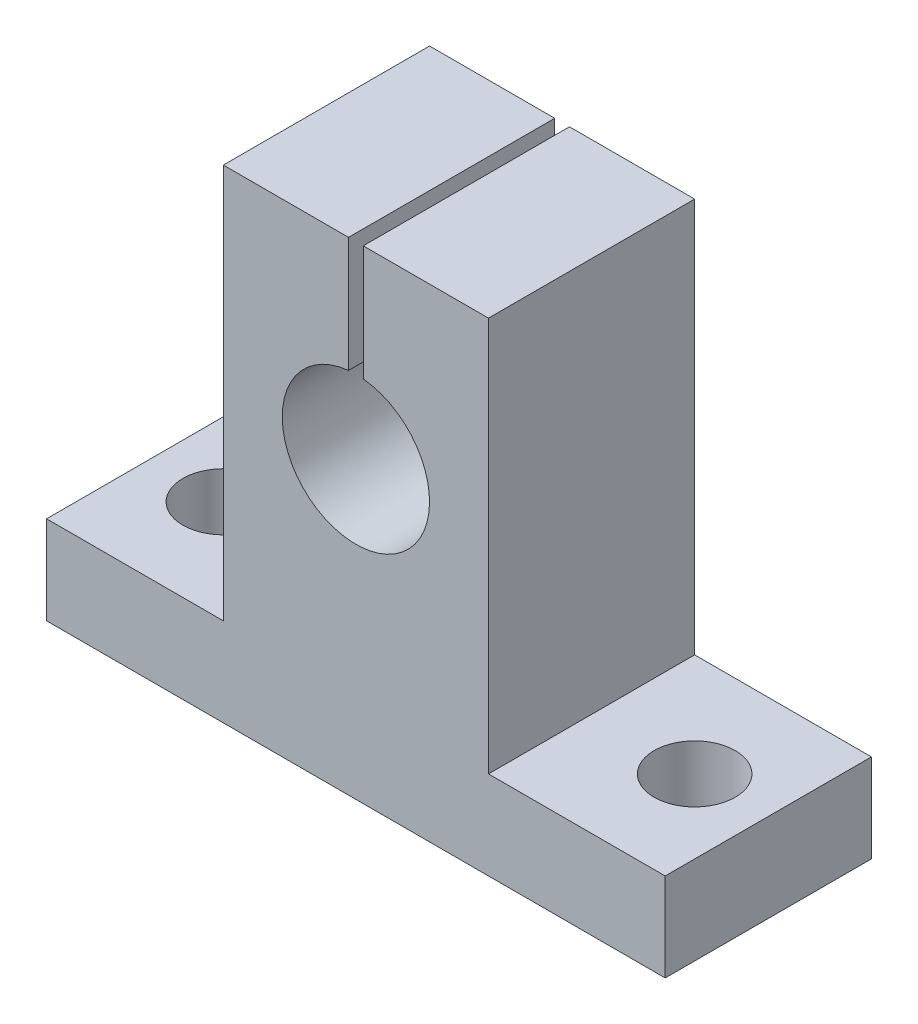
ISO-10303-21;
HEADER;
FILE_DESCRIPTION(('STEP AP214'),'2;1');
FILE_NAME('part.step','',(''),(''),'','','');
FILE_SCHEMA(('AUTOMOTIVE_DESIGN { 1 0 10303 214 1 1 1 1 }'));
ENDSEC;
DATA;
#1=APPLICATION_CONTEXT('core data for automotive mechanical design processes');
#2=APPLICATION_PROTOCOL_DEFINITION('international standard','automotive_design',2000,#1);
#3=PRODUCT_CONTEXT('',#1,'mechanical');
#4=PRODUCT('Part','Part','',(#3));
#5=PRODUCT_RELATED_PRODUCT_CATEGORY('part','',(#4));
#6=PRODUCT_DEFINITION_FORMATION('','',#4);
#7=PRODUCT_DEFINITION_CONTEXT('part definition',#1,'design');
#8=PRODUCT_DEFINITION('design','',#6,#7);
#9=PRODUCT_DEFINITION_SHAPE('','',#8);
#10=(LENGTH_UNIT() NAMED_UNIT(*) SI_UNIT(.MILLI.,.METRE.));
#11=(NAMED_UNIT(*) PLANE_ANGLE_UNIT() SI_UNIT($,.RADIAN.));
#12=(NAMED_UNIT(*) SI_UNIT($,.STERADIAN.) SOLID_ANGLE_UNIT());
#13=UNCERTAINTY_MEASURE_WITH_UNIT(LENGTH_MEASURE(1.E-05),#10,'distance_accuracy_value','');
#14=(GEOMETRIC_REPRESENTATION_CONTEXT(3) GLOBAL_UNCERTAINTY_ASSIGNED_CONTEXT((#13)) GLOBAL_UNIT_ASSIGNED_CONTEXT((#10,
#11,#12)) REPRESENTATION_CONTEXT('',''));
#15=CARTESIAN_POINT('',(0.,0.,0.));
#16=DIRECTION('',(0.,0.,1.));
#17=DIRECTION('',(1.,0.,0.));
#18=AXIS2_PLACEMENT_3D('',#15,#16,#17);
#19=CARTESIAN_POINT('',(9.,12.8,14.));
#20=DIRECTION('',(0.,-1.,0.));
#21=DIRECTION('',(1.,0.,0.));
#22=AXIS2_PLACEMENT_3D('',#19,#20,#21);
#23=PLANE('',#22);
#24=DIRECTION('',(-1.,0.,0.));
#25=VECTOR('',#24,1.);
#26=CARTESIAN_POINT('',(9.,12.8,14.));
#27=LINE('',#26,#25);
#28=CARTESIAN_POINT('',(-0.5,12.8,14.));
#29=VERTEX_POINT('',#28);
#30=CARTESIAN_POINT('',(-9.,12.8,14.));
#31=VERTEX_POINT('',#30);
#32=EDGE_CURVE('E134',#29,#31,#27,.T.);
#33=ORIENTED_EDGE('',*,*,#32,.F.);
#34=DIRECTION('',(0.,0.,-1.));
#35=VECTOR('',#34,1.);
#36=CARTESIAN_POINT('',(-0.5,12.8,14.));
#37=LINE('',#36,#35);
#38=CARTESIAN_POINT('',(-0.5,12.8,0.));
#39=VERTEX_POINT('',#38);
#40=EDGE_CURVE('E120',#29,#39,#37,.T.);
#41=ORIENTED_EDGE('',*,*,#40,.T.);
#42=DIRECTION('',(-1.,0.,0.));
#43=VECTOR('',#42,1.);
#44=CARTESIAN_POINT('',(9.,12.8,0.));
#45=LINE('',#44,#43);
#46=CARTESIAN_POINT('',(-9.,12.8,0.));
#47=VERTEX_POINT('',#46);
#48=EDGE_CURVE('E168',#39,#47,#45,.T.);
#49=ORIENTED_EDGE('',*,*,#48,.T.);
#50=DIRECTION('',(0.,0.,-1.));
#51=VECTOR('',#50,1.);
#52=CARTESIAN_POINT('',(-9.,12.8,14.));
#53=LINE('',#52,#51);
#54=EDGE_CURVE('E143',#31,#47,#53,.T.);
#55=ORIENTED_EDGE('',*,*,#54,.F.);
#56=EDGE_LOOP('',(#33,#41,#49,#55));
#57=FACE_BOUND('',#56,.T.);
#58=ADVANCED_FACE('F34',(#57),#23,.F.);
#59=CARTESIAN_POINT('',(0.,0.,14.));
#60=DIRECTION('',(0.,0.,-1.));
#61=DIRECTION('',(-1.,0.,0.));
#62=AXIS2_PLACEMENT_3D('',#59,#60,#61);
#63=PLANE('',#62);
#64=CARTESIAN_POINT('',(0.,0.,14.));
#65=DIRECTION('',(0.,0.,1.));
#66=DIRECTION('',(1.,0.,0.));
#67=AXIS2_PLACEMENT_3D('',#64,#65,#66);
#68=CIRCLE('',#67,5.);
#69=CARTESIAN_POINT('',(-0.5,4.9749371855331,14.));
#70=VERTEX_POINT('',#69);
#71=CARTESIAN_POINT('',(0.5,4.9749371855331,14.));
#72=VERTEX_POINT('',#71);
#73=EDGE_CURVE('E138',#70,#72,#68,.T.);
#74=ORIENTED_EDGE('',*,*,#73,.F.);
#75=DIRECTION('',(0.,-1.,0.));
#76=VECTOR('',#75,1.);
#77=CARTESIAN_POINT('',(-0.5,-0.67078400819638,14.));
#78=LINE('',#77,#76);
#79=EDGE_CURVE('E56',#29,#70,#78,.T.);
#80=ORIENTED_EDGE('',*,*,#79,.F.);
#81=ORIENTED_EDGE('',*,*,#32,.T.);
#82=DIRECTION('',(0.,-1.,0.));
#83=VECTOR('',#82,1.);
#84=CARTESIAN_POINT('',(-9.,12.8,14.));
#85=LINE('',#84,#83);
#86=CARTESIAN_POINT('',(-9.,-14.,14.));
#87=VERTEX_POINT('',#86);
#88=EDGE_CURVE('E172',#31,#87,#85,.T.);
#89=ORIENTED_EDGE('',*,*,#88,.T.);
#90=DIRECTION('',(-1.,0.,0.));
#91=VECTOR('',#90,1.);
#92=CARTESIAN_POINT('',(-9.,-14.,14.));
#93=LINE('',#92,#91);
#94=CARTESIAN_POINT('',(-21.,-14.,14.));
#95=VERTEX_POINT('',#94);
#96=EDGE_CURVE('E207',#87,#95,#93,.T.);
#97=ORIENTED_EDGE('',*,*,#96,.T.);
#98=DIRECTION('',(0.,-1.,0.));
#99=VECTOR('',#98,1.);
#100=CARTESIAN_POINT('',(-21.,-14.,14.));
#101=LINE('',#100,#99);
#102=CARTESIAN_POINT('',(-21.,-20.,14.));
#103=VERTEX_POINT('',#102);
#104=EDGE_CURVE('E209',#95,#103,#101,.T.);
#105=ORIENTED_EDGE('',*,*,#104,.T.);
#106=DIRECTION('',(1.,0.,0.));
#107=VECTOR('',#106,1.);
#108=CARTESIAN_POINT('',(-21.,-20.,14.));
#109=LINE('',#108,#107);
#110=CARTESIAN_POINT('',(21.,-20.,14.));
#111=VERTEX_POINT('',#110);
#112=EDGE_CURVE('E211',#103,#111,#109,.T.);
#113=ORIENTED_EDGE('',*,*,#112,.T.);
#114=DIRECTION('',(0.,1.,0.));
#115=VECTOR('',#114,1.);
#116=CARTESIAN_POINT('',(21.,-14.,14.));
#117=LINE('',#116,#115);
#118=CARTESIAN_POINT('',(21.,-14.,14.));
#119=VERTEX_POINT('',#118);
#120=EDGE_CURVE('E213',#111,#119,#117,.T.);
#121=ORIENTED_EDGE('',*,*,#120,.T.);
#122=DIRECTION('',(-1.,0.,0.));
#123=VECTOR('',#122,1.);
#124=CARTESIAN_POINT('',(9.,-14.,14.));
#125=LINE('',#124,#123);
#126=CARTESIAN_POINT('',(9.,-14.,14.));
#127=VERTEX_POINT('',#126);
#128=EDGE_CURVE('E149',#119,#127,#125,.T.);
#129=ORIENTED_EDGE('',*,*,#128,.T.);
#130=DIRECTION('',(0.,1.,0.));
#131=VECTOR('',#130,1.);
#132=CARTESIAN_POINT('',(9.,12.8,14.));
#133=LINE('',#132,#131);
#134=CARTESIAN_POINT('',(9.,12.8,14.));
#135=VERTEX_POINT('',#134);
#136=EDGE_CURVE('E146',#127,#135,#133,.T.);
#137=ORIENTED_EDGE('',*,*,#136,.T.);
#138=CARTESIAN_POINT('',(0.5,12.8,14.));
#139=VERTEX_POINT('',#138);
#140=EDGE_CURVE('E145',#135,#139,#27,.T.);
#141=ORIENTED_EDGE('',*,*,#140,.T.);
#142=DIRECTION('',(0.,1.,0.));
#143=VECTOR('',#142,1.);
#144=CARTESIAN_POINT('',(0.5,-0.67078400819638,14.));
#145=LINE('',#144,#143);
#146=EDGE_CURVE('E139',#72,#139,#145,.T.);
#147=ORIENTED_EDGE('',*,*,#146,.F.);
#148=EDGE_LOOP('',(#74,#80,#81,#89,#97,#105,#113,#121,#129,#137,#141,#147));
#149=FACE_BOUND('',#148,.T.);
#150=ADVANCED_FACE('F132',(#149),#63,.F.);
#151=CARTESIAN_POINT('',(0.,0.,0.));
#152=DIRECTION('',(0.,0.,-1.));
#153=DIRECTION('',(-1.,0.,0.));
#154=AXIS2_PLACEMENT_3D('',#151,#152,#153);
#155=PLANE('',#154);
#156=DIRECTION('',(0.,-1.,0.));
#157=VECTOR('',#156,1.);
#158=CARTESIAN_POINT('',(-0.5,-0.67078400819638,0.));
#159=LINE('',#158,#157);
#160=CARTESIAN_POINT('',(-0.5,4.9749371855331,0.));
#161=VERTEX_POINT('',#160);
#162=EDGE_CURVE('E123',#39,#161,#159,.T.);
#163=ORIENTED_EDGE('',*,*,#162,.T.);
#164=CARTESIAN_POINT('',(0.,0.,0.));
#165=DIRECTION('',(0.,0.,1.));
#166=DIRECTION('',(1.,0.,0.));
#167=AXIS2_PLACEMENT_3D('',#164,#165,#166);
#168=CIRCLE('',#167,5.);
#169=CARTESIAN_POINT('',(0.5,4.9749371855331,0.));
#170=VERTEX_POINT('',#169);
#171=EDGE_CURVE('E127',#161,#170,#168,.T.);
#172=ORIENTED_EDGE('',*,*,#171,.T.);
#173=DIRECTION('',(0.,1.,0.));
#174=VECTOR('',#173,1.);
#175=CARTESIAN_POINT('',(0.5,-0.67078400819638,0.));
#176=LINE('',#175,#174);
#177=CARTESIAN_POINT('',(0.5,12.8,0.));
#178=VERTEX_POINT('',#177);
#179=EDGE_CURVE('E49',#170,#178,#176,.T.);
#180=ORIENTED_EDGE('',*,*,#179,.T.);
#181=CARTESIAN_POINT('',(9.,12.8,0.));
#182=VERTEX_POINT('',#181);
#183=EDGE_CURVE('E169',#182,#178,#45,.T.);
#184=ORIENTED_EDGE('',*,*,#183,.F.);
#185=DIRECTION('',(0.,1.,0.));
#186=VECTOR('',#185,1.);
#187=CARTESIAN_POINT('',(9.,12.8,0.));
#188=LINE('',#187,#186);
#189=CARTESIAN_POINT('',(9.,-14.,0.));
#190=VERTEX_POINT('',#189);
#191=EDGE_CURVE('E166',#190,#182,#188,.T.);
#192=ORIENTED_EDGE('',*,*,#191,.F.);
#193=DIRECTION('',(-1.,0.,0.));
#194=VECTOR('',#193,1.);
#195=CARTESIAN_POINT('',(9.,-14.,0.));
#196=LINE('',#195,#194);
#197=CARTESIAN_POINT('',(21.,-14.,0.));
#198=VERTEX_POINT('',#197);
#199=EDGE_CURVE('E164',#198,#190,#196,.T.);
#200=ORIENTED_EDGE('',*,*,#199,.F.);
#201=DIRECTION('',(0.,1.,0.));
#202=VECTOR('',#201,1.);
#203=CARTESIAN_POINT('',(21.,-14.,0.));
#204=LINE('',#203,#202);
#205=CARTESIAN_POINT('',(21.,-20.,0.));
#206=VERTEX_POINT('',#205);
#207=EDGE_CURVE('E162',#206,#198,#204,.T.);
#208=ORIENTED_EDGE('',*,*,#207,.F.);
#209=DIRECTION('',(1.,0.,0.));
#210=VECTOR('',#209,1.);
#211=CARTESIAN_POINT('',(-21.,-20.,0.));
#212=LINE('',#211,#210);
#213=CARTESIAN_POINT('',(-21.,-20.,0.));
#214=VERTEX_POINT('',#213);
#215=EDGE_CURVE('E160',#214,#206,#212,.T.);
#216=ORIENTED_EDGE('',*,*,#215,.F.);
#217=DIRECTION('',(0.,-1.,0.));
#218=VECTOR('',#217,1.);
#219=CARTESIAN_POINT('',(-21.,-14.,0.));
#220=LINE('',#219,#218);
#221=CARTESIAN_POINT('',(-21.,-14.,0.));
#222=VERTEX_POINT('',#221);
#223=EDGE_CURVE('E158',#222,#214,#220,.T.);
#224=ORIENTED_EDGE('',*,*,#223,.F.);
#225=DIRECTION('',(-1.,0.,0.));
#226=VECTOR('',#225,1.);
#227=CARTESIAN_POINT('',(-9.,-14.,0.));
#228=LINE('',#227,#226);
#229=CARTESIAN_POINT('',(-9.,-14.,0.));
#230=VERTEX_POINT('',#229);
#231=EDGE_CURVE('E156',#230,#222,#228,.T.);
#232=ORIENTED_EDGE('',*,*,#231,.F.);
#233=DIRECTION('',(0.,-1.,0.));
#234=VECTOR('',#233,1.);
#235=CARTESIAN_POINT('',(-9.,12.8,0.));
#236=LINE('',#235,#234);
#237=EDGE_CURVE('E153',#47,#230,#236,.T.);
#238=ORIENTED_EDGE('',*,*,#237,.F.);
#239=ORIENTED_EDGE('',*,*,#48,.F.);
#240=EDGE_LOOP('',(#163,#172,#180,#184,#192,#200,#208,#216,#224,#232,#238,#239));
#241=FACE_BOUND('',#240,.T.);
#242=ADVANCED_FACE('F267',(#241),#155,.T.);
#243=CARTESIAN_POINT('',(-9.,12.8,14.));
#244=DIRECTION('',(1.,0.,0.));
#245=DIRECTION('',(0.,1.,0.));
#246=AXIS2_PLACEMENT_3D('',#243,#244,#245);
#247=PLANE('',#246);
#248=ORIENTED_EDGE('',*,*,#237,.T.);
#249=DIRECTION('',(0.,0.,-1.));
#250=VECTOR('',#249,1.);
#251=CARTESIAN_POINT('',(-9.,-14.,14.));
#252=LINE('',#251,#250);
#253=EDGE_CURVE('E192',#87,#230,#252,.T.);
#254=ORIENTED_EDGE('',*,*,#253,.F.);
#255=ORIENTED_EDGE('',*,*,#88,.F.);
#256=ORIENTED_EDGE('',*,*,#54,.T.);
#257=EDGE_LOOP('',(#248,#254,#255,#256));
#258=FACE_BOUND('',#257,.T.);
#259=ADVANCED_FACE('F36',(#258),#247,.F.);
#260=CARTESIAN_POINT('',(-9.,-14.,14.));
#261=DIRECTION('',(0.,-1.,0.));
#262=DIRECTION('',(0.,0.,-1.));
#263=AXIS2_PLACEMENT_3D('',#260,#261,#262);
#264=PLANE('',#263);
#265=CARTESIAN_POINT('',(-16.,-14.,7.));
#266=DIRECTION('',(0.,1.,0.));
#267=DIRECTION('',(0.,0.,1.));
#268=AXIS2_PLACEMENT_3D('',#265,#266,#267);
#269=CIRCLE('',#268,2.75);
#270=CARTESIAN_POINT('',(-16.,-14.,9.75));
#271=VERTEX_POINT('',#270);
#272=EDGE_CURVE('E238',#271,#271,#269,.T.);
#273=ORIENTED_EDGE('',*,*,#272,.F.);
#274=EDGE_LOOP('',(#273));
#275=FACE_BOUND('',#274,.T.);
#276=ORIENTED_EDGE('',*,*,#231,.T.);
#277=DIRECTION('',(0.,0.,-1.));
#278=VECTOR('',#277,1.);
#279=CARTESIAN_POINT('',(-21.,-14.,14.));
#280=LINE('',#279,#278);
#281=EDGE_CURVE('E189',#95,#222,#280,.T.);
#282=ORIENTED_EDGE('',*,*,#281,.F.);
#283=ORIENTED_EDGE('',*,*,#96,.F.);
#284=ORIENTED_EDGE('',*,*,#253,.T.);
#285=EDGE_LOOP('',(#276,#282,#283,#284));
#286=FACE_BOUND('',#285,.T.);
#287=ADVANCED_FACE('F254',(#275,#286),#264,.F.);
#288=CARTESIAN_POINT('',(-21.,-14.,14.));
#289=DIRECTION('',(1.,0.,0.));
#290=DIRECTION('',(0.,0.,-1.));
#291=AXIS2_PLACEMENT_3D('',#288,#289,#290);
#292=PLANE('',#291);
#293=ORIENTED_EDGE('',*,*,#223,.T.);
#294=DIRECTION('',(0.,0.,-1.));
#295=VECTOR('',#294,1.);
#296=CARTESIAN_POINT('',(-21.,-20.,14.));
#297=LINE('',#296,#295);
#298=EDGE_CURVE('E186',#103,#214,#297,.T.);
#299=ORIENTED_EDGE('',*,*,#298,.F.);
#300=ORIENTED_EDGE('',*,*,#104,.F.);
#301=ORIENTED_EDGE('',*,*,#281,.T.);
#302=EDGE_LOOP('',(#293,#299,#300,#301));
#303=FACE_BOUND('',#302,.T.);
#304=ADVANCED_FACE('F257',(#303),#292,.F.);
#305=CARTESIAN_POINT('',(-21.,-20.,14.));
#306=DIRECTION('',(0.,1.,0.));
#307=DIRECTION('',(-1.,0.,0.));
#308=AXIS2_PLACEMENT_3D('',#305,#306,#307);
#309=PLANE('',#308);
#310=CARTESIAN_POINT('',(-16.,-20.,7.));
#311=DIRECTION('',(0.,1.,0.));
#312=DIRECTION('',(0.,0.,1.));
#313=AXIS2_PLACEMENT_3D('',#310,#311,#312);
#314=CIRCLE('',#313,2.75);
#315=CARTESIAN_POINT('',(-16.,-20.,9.75));
#316=VERTEX_POINT('',#315);
#317=EDGE_CURVE('E140',#316,#316,#314,.T.);
#318=ORIENTED_EDGE('',*,*,#317,.T.);
#319=EDGE_LOOP('',(#318));
#320=FACE_BOUND('',#319,.T.);
#321=CARTESIAN_POINT('',(16.,-20.,7.));
#322=DIRECTION('',(0.,1.,0.));
#323=DIRECTION('',(0.,0.,-1.));
#324=AXIS2_PLACEMENT_3D('',#321,#322,#323);
#325=CIRCLE('',#324,2.75);
#326=CARTESIAN_POINT('',(16.,-20.,4.25));
#327=VERTEX_POINT('',#326);
#328=EDGE_CURVE('E235',#327,#327,#325,.T.);
#329=ORIENTED_EDGE('',*,*,#328,.T.);
#330=EDGE_LOOP('',(#329));
#331=FACE_BOUND('',#330,.T.);
#332=ORIENTED_EDGE('',*,*,#215,.T.);
#333=DIRECTION('',(0.,0.,-1.));
#334=VECTOR('',#333,1.);
#335=CARTESIAN_POINT('',(21.,-20.,14.));
#336=LINE('',#335,#334);
#337=EDGE_CURVE('E183',#111,#206,#336,.T.);
#338=ORIENTED_EDGE('',*,*,#337,.F.);
#339=ORIENTED_EDGE('',*,*,#112,.F.);
#340=ORIENTED_EDGE('',*,*,#298,.T.);
#341=EDGE_LOOP('',(#332,#338,#339,#340));
#342=FACE_BOUND('',#341,.T.);
#343=ADVANCED_FACE('F244',(#320,#331,#342),#309,.F.);
#344=CARTESIAN_POINT('',(21.,-14.,14.));
#345=DIRECTION('',(-1.,0.,0.));
#346=DIRECTION('',(0.,-1.,0.));
#347=AXIS2_PLACEMENT_3D('',#344,#345,#346);
#348=PLANE('',#347);
#349=ORIENTED_EDGE('',*,*,#207,.T.);
#350=DIRECTION('',(0.,0.,-1.));
#351=VECTOR('',#350,1.);
#352=CARTESIAN_POINT('',(21.,-14.,14.));
#353=LINE('',#352,#351);
#354=EDGE_CURVE('E180',#119,#198,#353,.T.);
#355=ORIENTED_EDGE('',*,*,#354,.F.);
#356=ORIENTED_EDGE('',*,*,#120,.F.);
#357=ORIENTED_EDGE('',*,*,#337,.T.);
#358=EDGE_LOOP('',(#349,#355,#356,#357));
#359=FACE_BOUND('',#358,.T.);
#360=ADVANCED_FACE('F273',(#359),#348,.F.);
#361=CARTESIAN_POINT('',(9.,-14.,14.));
#362=DIRECTION('',(0.,-1.,0.));
#363=DIRECTION('',(1.,0.,0.));
#364=AXIS2_PLACEMENT_3D('',#361,#362,#363);
#365=PLANE('',#364);
#366=CARTESIAN_POINT('',(16.,-14.,7.));
#367=DIRECTION('',(0.,1.,0.));
#368=DIRECTION('',(0.,0.,-1.));
#369=AXIS2_PLACEMENT_3D('',#366,#367,#368);
#370=CIRCLE('',#369,2.75);
#371=CARTESIAN_POINT('',(16.,-14.,4.25));
#372=VERTEX_POINT('',#371);
#373=EDGE_CURVE('E232',#372,#372,#370,.T.);
#374=ORIENTED_EDGE('',*,*,#373,.F.);
#375=EDGE_LOOP('',(#374));
#376=FACE_BOUND('',#375,.T.);
#377=ORIENTED_EDGE('',*,*,#199,.T.);
#378=DIRECTION('',(0.,0.,-1.));
#379=VECTOR('',#378,1.);
#380=CARTESIAN_POINT('',(9.,-14.,14.));
#381=LINE('',#380,#379);
#382=EDGE_CURVE('E177',#127,#190,#381,.T.);
#383=ORIENTED_EDGE('',*,*,#382,.F.);
#384=ORIENTED_EDGE('',*,*,#128,.F.);
#385=ORIENTED_EDGE('',*,*,#354,.T.);
#386=EDGE_LOOP('',(#377,#383,#384,#385));
#387=FACE_BOUND('',#386,.T.);
#388=ADVANCED_FACE('F221',(#376,#387),#365,.F.);
#389=CARTESIAN_POINT('',(9.,12.8,14.));
#390=DIRECTION('',(-1.,0.,0.));
#391=DIRECTION('',(0.,-1.,0.));
#392=AXIS2_PLACEMENT_3D('',#389,#390,#391);
#393=PLANE('',#392);
#394=ORIENTED_EDGE('',*,*,#191,.T.);
#395=DIRECTION('',(0.,0.,-1.));
#396=VECTOR('',#395,1.);
#397=CARTESIAN_POINT('',(9.,12.8,14.));
#398=LINE('',#397,#396);
#399=EDGE_CURVE('E174',#135,#182,#398,.T.);
#400=ORIENTED_EDGE('',*,*,#399,.F.);
#401=ORIENTED_EDGE('',*,*,#136,.F.);
#402=ORIENTED_EDGE('',*,*,#382,.T.);
#403=EDGE_LOOP('',(#394,#400,#401,#402));
#404=FACE_BOUND('',#403,.T.);
#405=ADVANCED_FACE('F225',(#404),#393,.F.);
#406=ORIENTED_EDGE('',*,*,#183,.T.);
#407=DIRECTION('',(0.,0.,1.));
#408=VECTOR('',#407,1.);
#409=CARTESIAN_POINT('',(0.5,12.8,14.));
#410=LINE('',#409,#408);
#411=EDGE_CURVE('E128',#178,#139,#410,.T.);
#412=ORIENTED_EDGE('',*,*,#411,.T.);
#413=ORIENTED_EDGE('',*,*,#140,.F.);
#414=ORIENTED_EDGE('',*,*,#399,.T.);
#415=EDGE_LOOP('',(#406,#412,#413,#414));
#416=FACE_BOUND('',#415,.T.);
#417=ADVANCED_FACE('F228',(#416),#23,.F.);
#418=CARTESIAN_POINT('',(0.,0.,14.));
#419=DIRECTION('',(0.,0.,-1.));
#420=DIRECTION('',(-1.,0.,0.));
#421=AXIS2_PLACEMENT_3D('',#418,#419,#420);
#422=CYLINDRICAL_SURFACE('',#421,5.);
#423=DIRECTION('',(0.,0.,-1.));
#424=VECTOR('',#423,1.);
#425=CARTESIAN_POINT('',(-0.5,4.9749371855331,14.));
#426=LINE('',#425,#424);
#427=EDGE_CURVE('E11',#70,#161,#426,.T.);
#428=ORIENTED_EDGE('',*,*,#427,.F.);
#429=ORIENTED_EDGE('',*,*,#73,.T.);
#430=DIRECTION('',(0.,0.,-1.));
#431=VECTOR('',#430,1.);
#432=CARTESIAN_POINT('',(0.5,4.9749371855331,14.));
#433=LINE('',#432,#431);
#434=EDGE_CURVE('E42',#170,#72,#433,.F.);
#435=ORIENTED_EDGE('',*,*,#434,.F.);
#436=ORIENTED_EDGE('',*,*,#171,.F.);
#437=EDGE_LOOP('',(#428,#429,#435,#436));
#438=FACE_BOUND('',#437,.T.);
#439=ADVANCED_FACE('F201',(#438),#422,.F.);
#440=CARTESIAN_POINT('',(0.5,-0.67078400819638,0.));
#441=DIRECTION('',(1.,0.,0.));
#442=DIRECTION('',(0.,0.,-1.));
#443=AXIS2_PLACEMENT_3D('',#440,#441,#442);
#444=PLANE('',#443);
#445=ORIENTED_EDGE('',*,*,#179,.F.);
#446=ORIENTED_EDGE('',*,*,#434,.T.);
#447=ORIENTED_EDGE('',*,*,#146,.T.);
#448=ORIENTED_EDGE('',*,*,#411,.F.);
#449=EDGE_LOOP('',(#445,#446,#447,#448));
#450=FACE_BOUND('',#449,.T.);
#451=ADVANCED_FACE('F194',(#450),#444,.F.);
#452=CARTESIAN_POINT('',(-0.5,-0.67078400819638,0.));
#453=DIRECTION('',(-1.,0.,0.));
#454=DIRECTION('',(0.,0.,1.));
#455=AXIS2_PLACEMENT_3D('',#452,#453,#454);
#456=PLANE('',#455);
#457=ORIENTED_EDGE('',*,*,#79,.T.);
#458=ORIENTED_EDGE('',*,*,#427,.T.);
#459=ORIENTED_EDGE('',*,*,#162,.F.);
#460=ORIENTED_EDGE('',*,*,#40,.F.);
#461=EDGE_LOOP('',(#457,#458,#459,#460));
#462=FACE_BOUND('',#461,.T.);
#463=ADVANCED_FACE('F121',(#462),#456,.F.);
#464=CARTESIAN_POINT('',(16.,-20.,7.));
#465=DIRECTION('',(0.,1.,0.));
#466=DIRECTION('',(0.,0.,1.));
#467=AXIS2_PLACEMENT_3D('',#464,#465,#466);
#468=CYLINDRICAL_SURFACE('',#467,2.75);
#469=ORIENTED_EDGE('',*,*,#328,.F.);
#470=EDGE_LOOP('',(#469));
#471=FACE_BOUND('',#470,.T.);
#472=ORIENTED_EDGE('',*,*,#373,.T.);
#473=EDGE_LOOP('',(#472));
#474=FACE_BOUND('',#473,.T.);
#475=ADVANCED_FACE('F250',(#471,#474),#468,.F.);
#476=CARTESIAN_POINT('',(-16.,-20.,7.));
#477=DIRECTION('',(0.,1.,0.));
#478=DIRECTION('',(0.,0.,1.));
#479=AXIS2_PLACEMENT_3D('',#476,#477,#478);
#480=CYLINDRICAL_SURFACE('',#479,2.75);
#481=ORIENTED_EDGE('',*,*,#317,.F.);
#482=EDGE_LOOP('',(#481));
#483=FACE_BOUND('',#482,.T.);
#484=ORIENTED_EDGE('',*,*,#272,.T.);
#485=EDGE_LOOP('',(#484));
#486=FACE_BOUND('',#485,.T.);
#487=ADVANCED_FACE('F247',(#483,#486),#480,.F.);
#488=CLOSED_SHELL('',(#58,#150,#242,#259,#287,#304,#343,#360,#388,#405,#417,#439,#451,#463,#475,#487));
#489=MANIFOLD_SOLID_BREP('B2',#488);
#490=ADVANCED_BREP_SHAPE_REPRESENTATION('',(#18,#489),#14);
#491=SHAPE_DEFINITION_REPRESENTATION(#9,#490);
ENDSEC;
END-ISO-10303-21;
